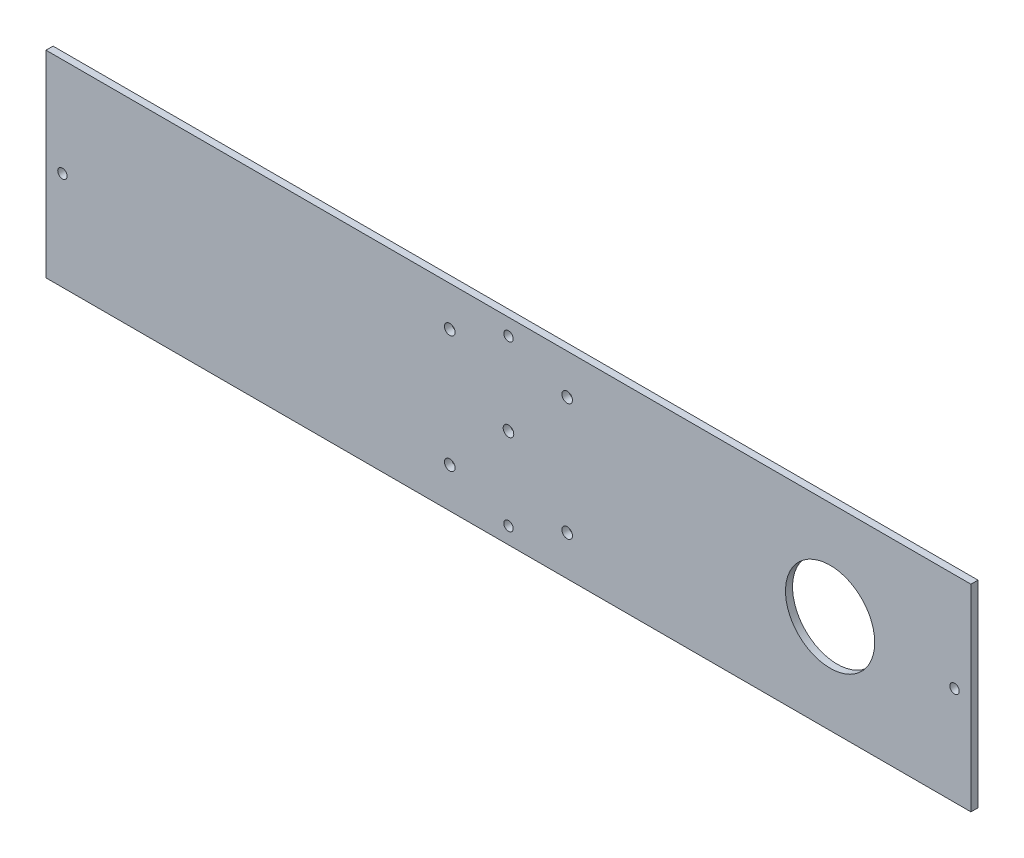
ISO-10303-21;
HEADER;
FILE_DESCRIPTION(('STEP AP214'),'2;1');
FILE_NAME('part.step','',(''),(''),'','','');
FILE_SCHEMA(('AUTOMOTIVE_DESIGN { 1 0 10303 214 1 1 1 1 }'));
ENDSEC;
DATA;
#1=APPLICATION_CONTEXT('core data for automotive mechanical design processes');
#2=APPLICATION_PROTOCOL_DEFINITION('international standard','automotive_design',2000,#1);
#3=PRODUCT_CONTEXT('',#1,'mechanical');
#4=PRODUCT('Part','Part','',(#3));
#5=PRODUCT_RELATED_PRODUCT_CATEGORY('part','',(#4));
#6=PRODUCT_DEFINITION_FORMATION('','',#4);
#7=PRODUCT_DEFINITION_CONTEXT('part definition',#1,'design');
#8=PRODUCT_DEFINITION('design','',#6,#7);
#9=PRODUCT_DEFINITION_SHAPE('','',#8);
#10=(LENGTH_UNIT() NAMED_UNIT(*) SI_UNIT(.MILLI.,.METRE.));
#11=(NAMED_UNIT(*) PLANE_ANGLE_UNIT() SI_UNIT($,.RADIAN.));
#12=(NAMED_UNIT(*) SI_UNIT($,.STERADIAN.) SOLID_ANGLE_UNIT());
#13=UNCERTAINTY_MEASURE_WITH_UNIT(LENGTH_MEASURE(1.E-05),#10,'distance_accuracy_value','');
#14=(GEOMETRIC_REPRESENTATION_CONTEXT(3) GLOBAL_UNCERTAINTY_ASSIGNED_CONTEXT((#13)) GLOBAL_UNIT_ASSIGNED_CONTEXT((#10,
#11,#12)) REPRESENTATION_CONTEXT('',''));
#15=CARTESIAN_POINT('',(0.,0.,0.));
#16=DIRECTION('',(0.,0.,1.));
#17=DIRECTION('',(1.,0.,0.));
#18=AXIS2_PLACEMENT_3D('',#15,#16,#17);
#19=CARTESIAN_POINT('',(0.,0.,3.));
#20=DIRECTION('',(0.,0.,-1.));
#21=DIRECTION('',(-1.,0.,0.));
#22=AXIS2_PLACEMENT_3D('',#19,#20,#21);
#23=PLANE('',#22);
#24=CARTESIAN_POINT('',(222.,67.,3.));
#25=DIRECTION('',(0.,0.,1.));
#26=DIRECTION('',(1.,0.,0.));
#27=AXIS2_PLACEMENT_3D('',#24,#25,#26);
#28=CIRCLE('',#27,2.25000000000001);
#29=CARTESIAN_POINT('',(224.25,67.,3.));
#30=VERTEX_POINT('',#29);
#31=EDGE_CURVE('E157',#30,#30,#28,.T.);
#32=ORIENTED_EDGE('',*,*,#31,.F.);
#33=EDGE_LOOP('',(#32));
#34=FACE_BOUND('',#33,.T.);
#35=CARTESIAN_POINT('',(172.,17.,3.));
#36=DIRECTION('',(0.,0.,1.));
#37=DIRECTION('',(1.,0.,0.));
#38=AXIS2_PLACEMENT_3D('',#35,#36,#37);
#39=CIRCLE('',#38,2.25000000000001);
#40=CARTESIAN_POINT('',(174.25,17.,3.));
#41=VERTEX_POINT('',#40);
#42=EDGE_CURVE('E145',#41,#41,#39,.T.);
#43=ORIENTED_EDGE('',*,*,#42,.F.);
#44=EDGE_LOOP('',(#43));
#45=FACE_BOUND('',#44,.T.);
#46=CARTESIAN_POINT('',(197.,42.,3.));
#47=DIRECTION('',(0.,0.,1.));
#48=DIRECTION('',(1.,0.,0.));
#49=AXIS2_PLACEMENT_3D('',#46,#47,#48);
#50=CIRCLE('',#49,2.25000000000001);
#51=CARTESIAN_POINT('',(199.25,42.,3.));
#52=VERTEX_POINT('',#51);
#53=EDGE_CURVE('E133',#52,#52,#50,.T.);
#54=ORIENTED_EDGE('',*,*,#53,.F.);
#55=EDGE_LOOP('',(#54));
#56=FACE_BOUND('',#55,.T.);
#57=CARTESIAN_POINT('',(197.,6.99999999999998,3.));
#58=DIRECTION('',(0.,0.,1.));
#59=DIRECTION('',(1.,0.,0.));
#60=AXIS2_PLACEMENT_3D('',#57,#58,#59);
#61=CIRCLE('',#60,2.);
#62=CARTESIAN_POINT('',(199.,6.99999999999998,3.));
#63=VERTEX_POINT('',#62);
#64=EDGE_CURVE('E121',#63,#63,#61,.T.);
#65=ORIENTED_EDGE('',*,*,#64,.F.);
#66=EDGE_LOOP('',(#65));
#67=FACE_BOUND('',#66,.T.);
#68=CARTESIAN_POINT('',(7.,42.,3.));
#69=DIRECTION('',(0.,0.,1.));
#70=DIRECTION('',(1.,0.,0.));
#71=AXIS2_PLACEMENT_3D('',#68,#69,#70);
#72=CIRCLE('',#71,2.);
#73=CARTESIAN_POINT('',(9.,42.,3.));
#74=VERTEX_POINT('',#73);
#75=EDGE_CURVE('E100',#74,#74,#72,.T.);
#76=ORIENTED_EDGE('',*,*,#75,.F.);
#77=EDGE_LOOP('',(#76));
#78=FACE_BOUND('',#77,.T.);
#79=DIRECTION('',(1.,0.,0.));
#80=VECTOR('',#79,1.);
#81=CARTESIAN_POINT('',(394.,0.,3.));
#82=LINE('',#81,#80);
#83=CARTESIAN_POINT('',(0.,0.,3.));
#84=VERTEX_POINT('',#83);
#85=CARTESIAN_POINT('',(394.,0.,3.));
#86=VERTEX_POINT('',#85);
#87=EDGE_CURVE('E85',#84,#86,#82,.T.);
#88=ORIENTED_EDGE('',*,*,#87,.T.);
#89=DIRECTION('',(0.,1.,0.));
#90=VECTOR('',#89,1.);
#91=CARTESIAN_POINT('',(394.,84.,3.));
#92=LINE('',#91,#90);
#93=CARTESIAN_POINT('',(394.,84.,3.));
#94=VERTEX_POINT('',#93);
#95=EDGE_CURVE('E80',#86,#94,#92,.T.);
#96=ORIENTED_EDGE('',*,*,#95,.T.);
#97=DIRECTION('',(-1.,0.,0.));
#98=VECTOR('',#97,1.);
#99=CARTESIAN_POINT('',(0.,84.,3.));
#100=LINE('',#99,#98);
#101=CARTESIAN_POINT('',(0.,84.,3.));
#102=VERTEX_POINT('',#101);
#103=EDGE_CURVE('E83',#94,#102,#100,.T.);
#104=ORIENTED_EDGE('',*,*,#103,.T.);
#105=DIRECTION('',(0.,-1.,0.));
#106=VECTOR('',#105,1.);
#107=CARTESIAN_POINT('',(0.,0.,3.));
#108=LINE('',#107,#106);
#109=EDGE_CURVE('E50',#102,#84,#108,.T.);
#110=ORIENTED_EDGE('',*,*,#109,.T.);
#111=EDGE_LOOP('',(#88,#96,#104,#110));
#112=FACE_BOUND('',#111,.T.);
#113=CARTESIAN_POINT('',(197.,77.,3.));
#114=DIRECTION('',(0.,0.,1.));
#115=DIRECTION('',(1.,0.,0.));
#116=AXIS2_PLACEMENT_3D('',#113,#114,#115);
#117=CIRCLE('',#116,2.);
#118=CARTESIAN_POINT('',(199.,77.,3.));
#119=VERTEX_POINT('',#118);
#120=EDGE_CURVE('E115',#119,#119,#117,.T.);
#121=ORIENTED_EDGE('',*,*,#120,.F.);
#122=EDGE_LOOP('',(#121));
#123=FACE_BOUND('',#122,.T.);
#124=CARTESIAN_POINT('',(387.,42.,3.));
#125=DIRECTION('',(0.,0.,1.));
#126=DIRECTION('',(1.,0.,0.));
#127=AXIS2_PLACEMENT_3D('',#124,#125,#126);
#128=CIRCLE('',#127,2.);
#129=CARTESIAN_POINT('',(389.,42.,3.));
#130=VERTEX_POINT('',#129);
#131=EDGE_CURVE('E127',#130,#130,#128,.T.);
#132=ORIENTED_EDGE('',*,*,#131,.F.);
#133=EDGE_LOOP('',(#132));
#134=FACE_BOUND('',#133,.T.);
#135=CARTESIAN_POINT('',(172.,67.,3.));
#136=DIRECTION('',(0.,0.,1.));
#137=DIRECTION('',(1.,0.,0.));
#138=AXIS2_PLACEMENT_3D('',#135,#136,#137);
#139=CIRCLE('',#138,2.25000000000001);
#140=CARTESIAN_POINT('',(174.25,67.,3.));
#141=VERTEX_POINT('',#140);
#142=EDGE_CURVE('E139',#141,#141,#139,.T.);
#143=ORIENTED_EDGE('',*,*,#142,.F.);
#144=EDGE_LOOP('',(#143));
#145=FACE_BOUND('',#144,.T.);
#146=CARTESIAN_POINT('',(222.,17.,3.));
#147=DIRECTION('',(0.,0.,1.));
#148=DIRECTION('',(1.,0.,0.));
#149=AXIS2_PLACEMENT_3D('',#146,#147,#148);
#150=CIRCLE('',#149,2.25000000000001);
#151=CARTESIAN_POINT('',(224.25,17.,3.));
#152=VERTEX_POINT('',#151);
#153=EDGE_CURVE('E151',#152,#152,#150,.T.);
#154=ORIENTED_EDGE('',*,*,#153,.F.);
#155=EDGE_LOOP('',(#154));
#156=FACE_BOUND('',#155,.T.);
#157=CARTESIAN_POINT('',(334.,42.,3.));
#158=DIRECTION('',(0.,0.,1.));
#159=DIRECTION('',(1.,0.,0.));
#160=AXIS2_PLACEMENT_3D('',#157,#158,#159);
#161=CIRCLE('',#160,19.);
#162=CARTESIAN_POINT('',(353.,42.,3.));
#163=VERTEX_POINT('',#162);
#164=EDGE_CURVE('E163',#163,#163,#161,.T.);
#165=ORIENTED_EDGE('',*,*,#164,.F.);
#166=EDGE_LOOP('',(#165));
#167=FACE_BOUND('',#166,.T.);
#168=ADVANCED_FACE('F33',(#34,#45,#56,#67,#78,#112,#123,#134,#145,#156,#167),#23,.F.);
#169=CARTESIAN_POINT('',(0.,0.,0.));
#170=DIRECTION('',(0.,0.,-1.));
#171=DIRECTION('',(-1.,0.,0.));
#172=AXIS2_PLACEMENT_3D('',#169,#170,#171);
#173=PLANE('',#172);
#174=CARTESIAN_POINT('',(222.,67.,0.));
#175=DIRECTION('',(0.,0.,1.));
#176=DIRECTION('',(1.,0.,0.));
#177=AXIS2_PLACEMENT_3D('',#174,#175,#176);
#178=CIRCLE('',#177,2.25000000000001);
#179=CARTESIAN_POINT('',(224.25,67.,0.));
#180=VERTEX_POINT('',#179);
#181=EDGE_CURVE('E160',#180,#180,#178,.T.);
#182=ORIENTED_EDGE('',*,*,#181,.T.);
#183=EDGE_LOOP('',(#182));
#184=FACE_BOUND('',#183,.T.);
#185=CARTESIAN_POINT('',(172.,17.,0.));
#186=DIRECTION('',(0.,0.,1.));
#187=DIRECTION('',(1.,0.,0.));
#188=AXIS2_PLACEMENT_3D('',#185,#186,#187);
#189=CIRCLE('',#188,2.25000000000001);
#190=CARTESIAN_POINT('',(174.25,17.,0.));
#191=VERTEX_POINT('',#190);
#192=EDGE_CURVE('E148',#191,#191,#189,.T.);
#193=ORIENTED_EDGE('',*,*,#192,.T.);
#194=EDGE_LOOP('',(#193));
#195=FACE_BOUND('',#194,.T.);
#196=CARTESIAN_POINT('',(197.,42.,0.));
#197=DIRECTION('',(0.,0.,1.));
#198=DIRECTION('',(1.,0.,0.));
#199=AXIS2_PLACEMENT_3D('',#196,#197,#198);
#200=CIRCLE('',#199,2.25000000000001);
#201=CARTESIAN_POINT('',(199.25,42.,0.));
#202=VERTEX_POINT('',#201);
#203=EDGE_CURVE('E136',#202,#202,#200,.T.);
#204=ORIENTED_EDGE('',*,*,#203,.T.);
#205=EDGE_LOOP('',(#204));
#206=FACE_BOUND('',#205,.T.);
#207=CARTESIAN_POINT('',(197.,6.99999999999998,0.));
#208=DIRECTION('',(0.,0.,1.));
#209=DIRECTION('',(1.,0.,0.));
#210=AXIS2_PLACEMENT_3D('',#207,#208,#209);
#211=CIRCLE('',#210,2.);
#212=CARTESIAN_POINT('',(199.,6.99999999999998,0.));
#213=VERTEX_POINT('',#212);
#214=EDGE_CURVE('E124',#213,#213,#211,.T.);
#215=ORIENTED_EDGE('',*,*,#214,.T.);
#216=EDGE_LOOP('',(#215));
#217=FACE_BOUND('',#216,.T.);
#218=CARTESIAN_POINT('',(7.,42.,0.));
#219=DIRECTION('',(0.,0.,1.));
#220=DIRECTION('',(1.,0.,0.));
#221=AXIS2_PLACEMENT_3D('',#218,#219,#220);
#222=CIRCLE('',#221,2.);
#223=CARTESIAN_POINT('',(9.,42.,0.));
#224=VERTEX_POINT('',#223);
#225=EDGE_CURVE('E112',#224,#224,#222,.T.);
#226=ORIENTED_EDGE('',*,*,#225,.T.);
#227=EDGE_LOOP('',(#226));
#228=FACE_BOUND('',#227,.T.);
#229=DIRECTION('',(1.,0.,0.));
#230=VECTOR('',#229,1.);
#231=CARTESIAN_POINT('',(394.,0.,0.));
#232=LINE('',#231,#230);
#233=CARTESIAN_POINT('',(0.,0.,0.));
#234=VERTEX_POINT('',#233);
#235=CARTESIAN_POINT('',(394.,0.,0.));
#236=VERTEX_POINT('',#235);
#237=EDGE_CURVE('E97',#234,#236,#232,.T.);
#238=ORIENTED_EDGE('',*,*,#237,.F.);
#239=DIRECTION('',(0.,-1.,0.));
#240=VECTOR('',#239,1.);
#241=CARTESIAN_POINT('',(0.,0.,0.));
#242=LINE('',#241,#240);
#243=CARTESIAN_POINT('',(0.,84.,0.));
#244=VERTEX_POINT('',#243);
#245=EDGE_CURVE('E73',#244,#234,#242,.T.);
#246=ORIENTED_EDGE('',*,*,#245,.F.);
#247=DIRECTION('',(-1.,0.,0.));
#248=VECTOR('',#247,1.);
#249=CARTESIAN_POINT('',(0.,84.,0.));
#250=LINE('',#249,#248);
#251=CARTESIAN_POINT('',(394.,84.,0.));
#252=VERTEX_POINT('',#251);
#253=EDGE_CURVE('E67',#252,#244,#250,.T.);
#254=ORIENTED_EDGE('',*,*,#253,.F.);
#255=DIRECTION('',(0.,1.,0.));
#256=VECTOR('',#255,1.);
#257=CARTESIAN_POINT('',(394.,84.,0.));
#258=LINE('',#257,#256);
#259=EDGE_CURVE('E89',#236,#252,#258,.T.);
#260=ORIENTED_EDGE('',*,*,#259,.F.);
#261=EDGE_LOOP('',(#238,#246,#254,#260));
#262=FACE_BOUND('',#261,.T.);
#263=CARTESIAN_POINT('',(197.,77.,0.));
#264=DIRECTION('',(0.,0.,1.));
#265=DIRECTION('',(1.,0.,0.));
#266=AXIS2_PLACEMENT_3D('',#263,#264,#265);
#267=CIRCLE('',#266,2.);
#268=CARTESIAN_POINT('',(199.,77.,0.));
#269=VERTEX_POINT('',#268);
#270=EDGE_CURVE('E118',#269,#269,#267,.T.);
#271=ORIENTED_EDGE('',*,*,#270,.T.);
#272=EDGE_LOOP('',(#271));
#273=FACE_BOUND('',#272,.T.);
#274=CARTESIAN_POINT('',(387.,42.,0.));
#275=DIRECTION('',(0.,0.,1.));
#276=DIRECTION('',(1.,0.,0.));
#277=AXIS2_PLACEMENT_3D('',#274,#275,#276);
#278=CIRCLE('',#277,2.);
#279=CARTESIAN_POINT('',(389.,42.,0.));
#280=VERTEX_POINT('',#279);
#281=EDGE_CURVE('E130',#280,#280,#278,.T.);
#282=ORIENTED_EDGE('',*,*,#281,.T.);
#283=EDGE_LOOP('',(#282));
#284=FACE_BOUND('',#283,.T.);
#285=CARTESIAN_POINT('',(172.,67.,0.));
#286=DIRECTION('',(0.,0.,1.));
#287=DIRECTION('',(1.,0.,0.));
#288=AXIS2_PLACEMENT_3D('',#285,#286,#287);
#289=CIRCLE('',#288,2.25000000000001);
#290=CARTESIAN_POINT('',(174.25,67.,0.));
#291=VERTEX_POINT('',#290);
#292=EDGE_CURVE('E142',#291,#291,#289,.T.);
#293=ORIENTED_EDGE('',*,*,#292,.T.);
#294=EDGE_LOOP('',(#293));
#295=FACE_BOUND('',#294,.T.);
#296=CARTESIAN_POINT('',(222.,17.,0.));
#297=DIRECTION('',(0.,0.,1.));
#298=DIRECTION('',(1.,0.,0.));
#299=AXIS2_PLACEMENT_3D('',#296,#297,#298);
#300=CIRCLE('',#299,2.25000000000001);
#301=CARTESIAN_POINT('',(224.25,17.,0.));
#302=VERTEX_POINT('',#301);
#303=EDGE_CURVE('E154',#302,#302,#300,.T.);
#304=ORIENTED_EDGE('',*,*,#303,.T.);
#305=EDGE_LOOP('',(#304));
#306=FACE_BOUND('',#305,.T.);
#307=CARTESIAN_POINT('',(334.,42.,0.));
#308=DIRECTION('',(0.,0.,1.));
#309=DIRECTION('',(1.,0.,0.));
#310=AXIS2_PLACEMENT_3D('',#307,#308,#309);
#311=CIRCLE('',#310,19.);
#312=CARTESIAN_POINT('',(353.,42.,0.));
#313=VERTEX_POINT('',#312);
#314=EDGE_CURVE('E166',#313,#313,#311,.T.);
#315=ORIENTED_EDGE('',*,*,#314,.T.);
#316=EDGE_LOOP('',(#315));
#317=FACE_BOUND('',#316,.T.);
#318=ADVANCED_FACE('F108',(#184,#195,#206,#217,#228,#262,#273,#284,#295,#306,#317),#173,.T.);
#319=CARTESIAN_POINT('',(394.,0.,3.));
#320=DIRECTION('',(0.,1.,0.));
#321=DIRECTION('',(-1.,0.,0.));
#322=AXIS2_PLACEMENT_3D('',#319,#320,#321);
#323=PLANE('',#322);
#324=ORIENTED_EDGE('',*,*,#237,.T.);
#325=DIRECTION('',(0.,0.,-1.));
#326=VECTOR('',#325,1.);
#327=CARTESIAN_POINT('',(394.,0.,3.));
#328=LINE('',#327,#326);
#329=EDGE_CURVE('E11',#86,#236,#328,.T.);
#330=ORIENTED_EDGE('',*,*,#329,.F.);
#331=ORIENTED_EDGE('',*,*,#87,.F.);
#332=DIRECTION('',(0.,0.,-1.));
#333=VECTOR('',#332,1.);
#334=CARTESIAN_POINT('',(0.,0.,3.));
#335=LINE('',#334,#333);
#336=EDGE_CURVE('E93',#84,#234,#335,.T.);
#337=ORIENTED_EDGE('',*,*,#336,.T.);
#338=EDGE_LOOP('',(#324,#330,#331,#337));
#339=FACE_BOUND('',#338,.T.);
#340=ADVANCED_FACE('F35',(#339),#323,.F.);
#341=CARTESIAN_POINT('',(394.,84.,3.));
#342=DIRECTION('',(-1.,0.,0.));
#343=DIRECTION('',(0.,0.,1.));
#344=AXIS2_PLACEMENT_3D('',#341,#342,#343);
#345=PLANE('',#344);
#346=ORIENTED_EDGE('',*,*,#259,.T.);
#347=DIRECTION('',(0.,0.,-1.));
#348=VECTOR('',#347,1.);
#349=CARTESIAN_POINT('',(394.,84.,3.));
#350=LINE('',#349,#348);
#351=EDGE_CURVE('E42',#94,#252,#350,.T.);
#352=ORIENTED_EDGE('',*,*,#351,.F.);
#353=ORIENTED_EDGE('',*,*,#95,.F.);
#354=ORIENTED_EDGE('',*,*,#329,.T.);
#355=EDGE_LOOP('',(#346,#352,#353,#354));
#356=FACE_BOUND('',#355,.T.);
#357=ADVANCED_FACE('F88',(#356),#345,.F.);
#358=CARTESIAN_POINT('',(0.,84.,3.));
#359=DIRECTION('',(0.,-1.,0.));
#360=DIRECTION('',(0.,0.,-1.));
#361=AXIS2_PLACEMENT_3D('',#358,#359,#360);
#362=PLANE('',#361);
#363=ORIENTED_EDGE('',*,*,#253,.T.);
#364=DIRECTION('',(0.,0.,-1.));
#365=VECTOR('',#364,1.);
#366=CARTESIAN_POINT('',(0.,84.,3.));
#367=LINE('',#366,#365);
#368=EDGE_CURVE('E90',#102,#244,#367,.T.);
#369=ORIENTED_EDGE('',*,*,#368,.F.);
#370=ORIENTED_EDGE('',*,*,#103,.F.);
#371=ORIENTED_EDGE('',*,*,#351,.T.);
#372=EDGE_LOOP('',(#363,#369,#370,#371));
#373=FACE_BOUND('',#372,.T.);
#374=ADVANCED_FACE('F91',(#373),#362,.F.);
#375=CARTESIAN_POINT('',(0.,0.,3.));
#376=DIRECTION('',(1.,0.,0.));
#377=DIRECTION('',(0.,0.,-1.));
#378=AXIS2_PLACEMENT_3D('',#375,#376,#377);
#379=PLANE('',#378);
#380=ORIENTED_EDGE('',*,*,#245,.T.);
#381=ORIENTED_EDGE('',*,*,#336,.F.);
#382=ORIENTED_EDGE('',*,*,#109,.F.);
#383=ORIENTED_EDGE('',*,*,#368,.T.);
#384=EDGE_LOOP('',(#380,#381,#382,#383));
#385=FACE_BOUND('',#384,.T.);
#386=ADVANCED_FACE('F105',(#385),#379,.F.);
#387=CARTESIAN_POINT('',(7.,42.,3.));
#388=DIRECTION('',(0.,0.,-1.));
#389=DIRECTION('',(-1.,0.,0.));
#390=AXIS2_PLACEMENT_3D('',#387,#388,#389);
#391=CYLINDRICAL_SURFACE('',#390,2.);
#392=ORIENTED_EDGE('',*,*,#75,.T.);
#393=EDGE_LOOP('',(#392));
#394=FACE_BOUND('',#393,.T.);
#395=ORIENTED_EDGE('',*,*,#225,.F.);
#396=EDGE_LOOP('',(#395));
#397=FACE_BOUND('',#396,.T.);
#398=ADVANCED_FACE('F186',(#394,#397),#391,.F.);
#399=CARTESIAN_POINT('',(197.,77.,3.));
#400=DIRECTION('',(0.,0.,-1.));
#401=DIRECTION('',(-1.,0.,0.));
#402=AXIS2_PLACEMENT_3D('',#399,#400,#401);
#403=CYLINDRICAL_SURFACE('',#402,2.);
#404=ORIENTED_EDGE('',*,*,#120,.T.);
#405=EDGE_LOOP('',(#404));
#406=FACE_BOUND('',#405,.T.);
#407=ORIENTED_EDGE('',*,*,#270,.F.);
#408=EDGE_LOOP('',(#407));
#409=FACE_BOUND('',#408,.T.);
#410=ADVANCED_FACE('F232',(#406,#409),#403,.F.);
#411=CARTESIAN_POINT('',(197.,6.99999999999998,3.));
#412=DIRECTION('',(0.,0.,-1.));
#413=DIRECTION('',(-1.,0.,0.));
#414=AXIS2_PLACEMENT_3D('',#411,#412,#413);
#415=CYLINDRICAL_SURFACE('',#414,2.);
#416=ORIENTED_EDGE('',*,*,#64,.T.);
#417=EDGE_LOOP('',(#416));
#418=FACE_BOUND('',#417,.T.);
#419=ORIENTED_EDGE('',*,*,#214,.F.);
#420=EDGE_LOOP('',(#419));
#421=FACE_BOUND('',#420,.T.);
#422=ADVANCED_FACE('F240',(#418,#421),#415,.F.);
#423=CARTESIAN_POINT('',(387.,42.,3.));
#424=DIRECTION('',(0.,0.,-1.));
#425=DIRECTION('',(-1.,0.,0.));
#426=AXIS2_PLACEMENT_3D('',#423,#424,#425);
#427=CYLINDRICAL_SURFACE('',#426,2.);
#428=ORIENTED_EDGE('',*,*,#131,.T.);
#429=EDGE_LOOP('',(#428));
#430=FACE_BOUND('',#429,.T.);
#431=ORIENTED_EDGE('',*,*,#281,.F.);
#432=EDGE_LOOP('',(#431));
#433=FACE_BOUND('',#432,.T.);
#434=ADVANCED_FACE('F248',(#430,#433),#427,.F.);
#435=CARTESIAN_POINT('',(197.,42.,3.));
#436=DIRECTION('',(0.,0.,-1.));
#437=DIRECTION('',(-1.,0.,0.));
#438=AXIS2_PLACEMENT_3D('',#435,#436,#437);
#439=CYLINDRICAL_SURFACE('',#438,2.25000000000001);
#440=ORIENTED_EDGE('',*,*,#53,.T.);
#441=EDGE_LOOP('',(#440));
#442=FACE_BOUND('',#441,.T.);
#443=ORIENTED_EDGE('',*,*,#203,.F.);
#444=EDGE_LOOP('',(#443));
#445=FACE_BOUND('',#444,.T.);
#446=ADVANCED_FACE('F257',(#442,#445),#439,.F.);
#447=CARTESIAN_POINT('',(172.,67.,3.));
#448=DIRECTION('',(0.,0.,-1.));
#449=DIRECTION('',(-1.,0.,0.));
#450=AXIS2_PLACEMENT_3D('',#447,#448,#449);
#451=CYLINDRICAL_SURFACE('',#450,2.25000000000001);
#452=ORIENTED_EDGE('',*,*,#142,.T.);
#453=EDGE_LOOP('',(#452));
#454=FACE_BOUND('',#453,.T.);
#455=ORIENTED_EDGE('',*,*,#292,.F.);
#456=EDGE_LOOP('',(#455));
#457=FACE_BOUND('',#456,.T.);
#458=ADVANCED_FACE('F266',(#454,#457),#451,.F.);
#459=CARTESIAN_POINT('',(172.,17.,3.));
#460=DIRECTION('',(0.,0.,-1.));
#461=DIRECTION('',(-1.,0.,0.));
#462=AXIS2_PLACEMENT_3D('',#459,#460,#461);
#463=CYLINDRICAL_SURFACE('',#462,2.25000000000001);
#464=ORIENTED_EDGE('',*,*,#42,.T.);
#465=EDGE_LOOP('',(#464));
#466=FACE_BOUND('',#465,.T.);
#467=ORIENTED_EDGE('',*,*,#192,.F.);
#468=EDGE_LOOP('',(#467));
#469=FACE_BOUND('',#468,.T.);
#470=ADVANCED_FACE('F275',(#466,#469),#463,.F.);
#471=CARTESIAN_POINT('',(222.,17.,3.));
#472=DIRECTION('',(0.,0.,-1.));
#473=DIRECTION('',(-1.,0.,0.));
#474=AXIS2_PLACEMENT_3D('',#471,#472,#473);
#475=CYLINDRICAL_SURFACE('',#474,2.25000000000001);
#476=ORIENTED_EDGE('',*,*,#153,.T.);
#477=EDGE_LOOP('',(#476));
#478=FACE_BOUND('',#477,.T.);
#479=ORIENTED_EDGE('',*,*,#303,.F.);
#480=EDGE_LOOP('',(#479));
#481=FACE_BOUND('',#480,.T.);
#482=ADVANCED_FACE('F284',(#478,#481),#475,.F.);
#483=CARTESIAN_POINT('',(222.,67.,3.));
#484=DIRECTION('',(0.,0.,-1.));
#485=DIRECTION('',(-1.,0.,0.));
#486=AXIS2_PLACEMENT_3D('',#483,#484,#485);
#487=CYLINDRICAL_SURFACE('',#486,2.25000000000001);
#488=ORIENTED_EDGE('',*,*,#31,.T.);
#489=EDGE_LOOP('',(#488));
#490=FACE_BOUND('',#489,.T.);
#491=ORIENTED_EDGE('',*,*,#181,.F.);
#492=EDGE_LOOP('',(#491));
#493=FACE_BOUND('',#492,.T.);
#494=ADVANCED_FACE('F293',(#490,#493),#487,.F.);
#495=CARTESIAN_POINT('',(334.,42.,3.));
#496=DIRECTION('',(0.,0.,-1.));
#497=DIRECTION('',(-1.,0.,0.));
#498=AXIS2_PLACEMENT_3D('',#495,#496,#497);
#499=CYLINDRICAL_SURFACE('',#498,19.);
#500=ORIENTED_EDGE('',*,*,#164,.T.);
#501=EDGE_LOOP('',(#500));
#502=FACE_BOUND('',#501,.T.);
#503=ORIENTED_EDGE('',*,*,#314,.F.);
#504=EDGE_LOOP('',(#503));
#505=FACE_BOUND('',#504,.T.);
#506=ADVANCED_FACE('F172',(#502,#505),#499,.F.);
#507=CLOSED_SHELL('',(#168,#318,#340,#357,#374,#386,#398,#410,#422,#434,#446,#458,#470,#482,
#494,#506));
#508=MANIFOLD_SOLID_BREP('B2',#507);
#509=ADVANCED_BREP_SHAPE_REPRESENTATION('',(#18,#508),#14);
#510=SHAPE_DEFINITION_REPRESENTATION(#9,#509);
ENDSEC;
END-ISO-10303-21;
